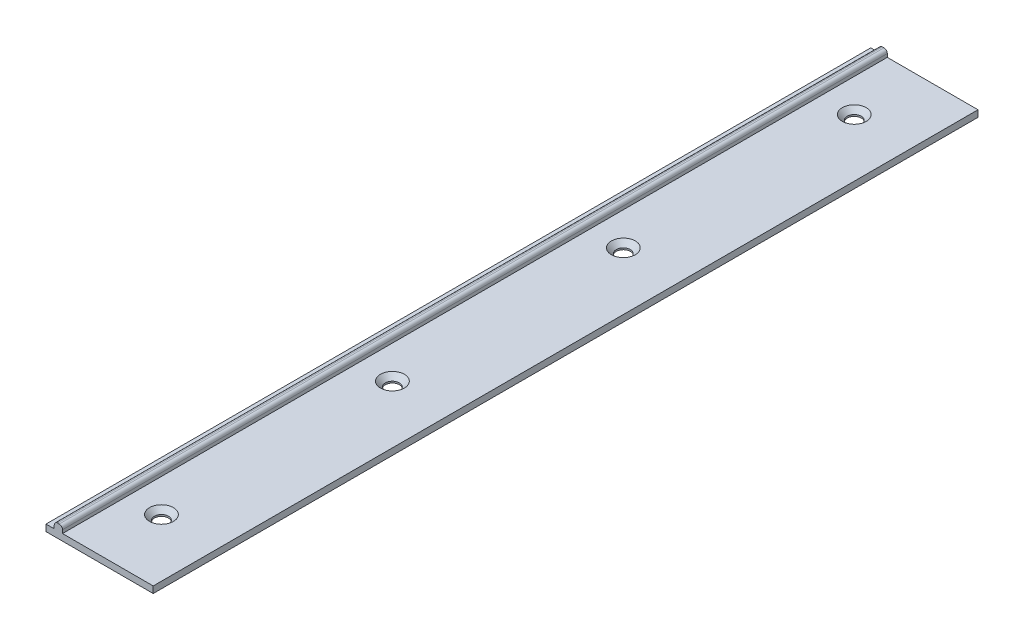
ISO-10303-21;
HEADER;
FILE_DESCRIPTION(('STEP AP214'),'2;1');
FILE_NAME('part.step','',(''),(''),'','','');
FILE_SCHEMA(('AUTOMOTIVE_DESIGN { 1 0 10303 214 1 1 1 1 }'));
ENDSEC;
DATA;
#1=APPLICATION_CONTEXT('core data for automotive mechanical design processes');
#2=APPLICATION_PROTOCOL_DEFINITION('international standard','automotive_design',2000,#1);
#3=PRODUCT_CONTEXT('',#1,'mechanical');
#4=PRODUCT('Part','Part','',(#3));
#5=PRODUCT_RELATED_PRODUCT_CATEGORY('part','',(#4));
#6=PRODUCT_DEFINITION_FORMATION('','',#4);
#7=PRODUCT_DEFINITION_CONTEXT('part definition',#1,'design');
#8=PRODUCT_DEFINITION('design','',#6,#7);
#9=PRODUCT_DEFINITION_SHAPE('','',#8);
#10=(LENGTH_UNIT() NAMED_UNIT(*) SI_UNIT(.MILLI.,.METRE.));
#11=(NAMED_UNIT(*) PLANE_ANGLE_UNIT() SI_UNIT($,.RADIAN.));
#12=(NAMED_UNIT(*) SI_UNIT($,.STERADIAN.) SOLID_ANGLE_UNIT());
#13=UNCERTAINTY_MEASURE_WITH_UNIT(LENGTH_MEASURE(1.E-05),#10,'distance_accuracy_value','');
#14=(GEOMETRIC_REPRESENTATION_CONTEXT(3) GLOBAL_UNCERTAINTY_ASSIGNED_CONTEXT((#13)) GLOBAL_UNIT_ASSIGNED_CONTEXT((#10,
#11,#12)) REPRESENTATION_CONTEXT('',''));
#15=CARTESIAN_POINT('',(0.,0.,0.));
#16=DIRECTION('',(0.,0.,1.));
#17=DIRECTION('',(1.,0.,0.));
#18=AXIS2_PLACEMENT_3D('',#15,#16,#17);
#19=CARTESIAN_POINT('',(0.,0.,-500.));
#20=DIRECTION('',(-1.,0.,0.));
#21=DIRECTION('',(0.,0.,1.));
#22=AXIS2_PLACEMENT_3D('',#19,#20,#21);
#23=PLANE('',#22);
#24=DIRECTION('',(0.,-1.,0.));
#25=VECTOR('',#24,1.);
#26=CARTESIAN_POINT('',(0.,0.,0.));
#27=LINE('',#26,#25);
#28=CARTESIAN_POINT('',(0.,4.,0.));
#29=VERTEX_POINT('',#28);
#30=CARTESIAN_POINT('',(0.,0.,0.));
#31=VERTEX_POINT('',#30);
#32=EDGE_CURVE('E163',#29,#31,#27,.T.);
#33=ORIENTED_EDGE('',*,*,#32,.F.);
#34=DIRECTION('',(0.,0.,1.));
#35=VECTOR('',#34,1.);
#36=CARTESIAN_POINT('',(0.,4.,-500.));
#37=LINE('',#36,#35);
#38=CARTESIAN_POINT('',(0.,4.,-500.));
#39=VERTEX_POINT('',#38);
#40=EDGE_CURVE('E141',#39,#29,#37,.T.);
#41=ORIENTED_EDGE('',*,*,#40,.F.);
#42=DIRECTION('',(0.,-1.,0.));
#43=VECTOR('',#42,1.);
#44=CARTESIAN_POINT('',(0.,0.,-500.));
#45=LINE('',#44,#43);
#46=CARTESIAN_POINT('',(0.,0.,-500.));
#47=VERTEX_POINT('',#46);
#48=EDGE_CURVE('E135',#39,#47,#45,.T.);
#49=ORIENTED_EDGE('',*,*,#48,.T.);
#50=DIRECTION('',(0.,0.,1.));
#51=VECTOR('',#50,1.);
#52=CARTESIAN_POINT('',(0.,0.,-500.));
#53=LINE('',#52,#51);
#54=EDGE_CURVE('E118',#47,#31,#53,.T.);
#55=ORIENTED_EDGE('',*,*,#54,.T.);
#56=EDGE_LOOP('',(#33,#41,#49,#55));
#57=FACE_BOUND('',#56,.T.);
#58=ADVANCED_FACE('F38',(#57),#23,.T.);
#59=CARTESIAN_POINT('',(0.,4.,-500.));
#60=DIRECTION('',(0.,1.,0.));
#61=DIRECTION('',(0.,0.,1.));
#62=AXIS2_PLACEMENT_3D('',#59,#60,#61);
#63=PLANE('',#62);
#64=DIRECTION('',(-1.,0.,0.));
#65=VECTOR('',#64,1.);
#66=CARTESIAN_POINT('',(0.,4.,0.));
#67=LINE('',#66,#65);
#68=CARTESIAN_POINT('',(5.,4.,0.));
#69=VERTEX_POINT('',#68);
#70=EDGE_CURVE('E142',#69,#29,#67,.T.);
#71=ORIENTED_EDGE('',*,*,#70,.F.);
#72=DIRECTION('',(0.,0.,1.));
#73=VECTOR('',#72,1.);
#74=CARTESIAN_POINT('',(5.,4.,-500.));
#75=LINE('',#74,#73);
#76=CARTESIAN_POINT('',(5.,4.,-500.));
#77=VERTEX_POINT('',#76);
#78=EDGE_CURVE('E182',#77,#69,#75,.T.);
#79=ORIENTED_EDGE('',*,*,#78,.F.);
#80=DIRECTION('',(-1.,0.,0.));
#81=VECTOR('',#80,1.);
#82=CARTESIAN_POINT('',(0.,4.,-500.));
#83=LINE('',#82,#81);
#84=EDGE_CURVE('E129',#77,#39,#83,.T.);
#85=ORIENTED_EDGE('',*,*,#84,.T.);
#86=ORIENTED_EDGE('',*,*,#40,.T.);
#87=EDGE_LOOP('',(#71,#79,#85,#86));
#88=FACE_BOUND('',#87,.T.);
#89=ADVANCED_FACE('F243',(#88),#63,.T.);
#90=CARTESIAN_POINT('',(5.,4.,-500.));
#91=DIRECTION('',(-1.,0.,0.));
#92=DIRECTION('',(0.,0.,1.));
#93=AXIS2_PLACEMENT_3D('',#90,#91,#92);
#94=PLANE('',#93);
#95=DIRECTION('',(0.,-1.,0.));
#96=VECTOR('',#95,1.);
#97=CARTESIAN_POINT('',(5.,4.,0.));
#98=LINE('',#97,#96);
#99=CARTESIAN_POINT('',(5.,6.,0.));
#100=VERTEX_POINT('',#99);
#101=EDGE_CURVE('E145',#100,#69,#98,.T.);
#102=ORIENTED_EDGE('',*,*,#101,.F.);
#103=DIRECTION('',(0.,0.,1.));
#104=VECTOR('',#103,1.);
#105=CARTESIAN_POINT('',(5.,6.,-500.));
#106=LINE('',#105,#104);
#107=CARTESIAN_POINT('',(5.,6.,-500.));
#108=VERTEX_POINT('',#107);
#109=EDGE_CURVE('E54',#100,#108,#106,.F.);
#110=ORIENTED_EDGE('',*,*,#109,.T.);
#111=DIRECTION('',(0.,-1.,0.));
#112=VECTOR('',#111,1.);
#113=CARTESIAN_POINT('',(5.,4.,-500.));
#114=LINE('',#113,#112);
#115=EDGE_CURVE('E160',#108,#77,#114,.T.);
#116=ORIENTED_EDGE('',*,*,#115,.T.);
#117=ORIENTED_EDGE('',*,*,#78,.T.);
#118=EDGE_LOOP('',(#102,#110,#116,#117));
#119=FACE_BOUND('',#118,.T.);
#120=ADVANCED_FACE('F248',(#119),#94,.T.);
#121=CARTESIAN_POINT('',(5.,8.,-500.));
#122=DIRECTION('',(0.,1.,0.));
#123=DIRECTION('',(-1.,0.,0.));
#124=AXIS2_PLACEMENT_3D('',#121,#122,#123);
#125=PLANE('',#124);
#126=DIRECTION('',(-1.,0.,0.));
#127=VECTOR('',#126,1.);
#128=CARTESIAN_POINT('',(5.,8.,0.));
#129=LINE('',#128,#127);
#130=CARTESIAN_POINT('',(8.00000000000001,8.,0.));
#131=VERTEX_POINT('',#130);
#132=CARTESIAN_POINT('',(7.,8.,0.));
#133=VERTEX_POINT('',#132);
#134=EDGE_CURVE('E176',#131,#133,#129,.T.);
#135=ORIENTED_EDGE('',*,*,#134,.F.);
#136=DIRECTION('',(0.,0.,1.));
#137=VECTOR('',#136,1.);
#138=CARTESIAN_POINT('',(8.00000000000001,8.,-500.));
#139=LINE('',#138,#137);
#140=CARTESIAN_POINT('',(8.00000000000001,8.,-500.));
#141=VERTEX_POINT('',#140);
#142=EDGE_CURVE('E199',#131,#141,#139,.F.);
#143=ORIENTED_EDGE('',*,*,#142,.T.);
#144=DIRECTION('',(-1.,0.,0.));
#145=VECTOR('',#144,1.);
#146=CARTESIAN_POINT('',(5.,8.,-500.));
#147=LINE('',#146,#145);
#148=CARTESIAN_POINT('',(7.,8.,-500.));
#149=VERTEX_POINT('',#148);
#150=EDGE_CURVE('E158',#141,#149,#147,.T.);
#151=ORIENTED_EDGE('',*,*,#150,.T.);
#152=DIRECTION('',(0.,0.,1.));
#153=VECTOR('',#152,1.);
#154=CARTESIAN_POINT('',(7.,8.,-500.));
#155=LINE('',#154,#153);
#156=EDGE_CURVE('E196',#149,#133,#155,.T.);
#157=ORIENTED_EDGE('',*,*,#156,.T.);
#158=EDGE_LOOP('',(#135,#143,#151,#157));
#159=FACE_BOUND('',#158,.T.);
#160=ADVANCED_FACE('F325',(#159),#125,.T.);
#161=CARTESIAN_POINT('',(10.,8.,-500.));
#162=DIRECTION('',(1.,0.,0.));
#163=DIRECTION('',(0.,1.,0.));
#164=AXIS2_PLACEMENT_3D('',#161,#162,#163);
#165=PLANE('',#164);
#166=DIRECTION('',(0.,1.,0.));
#167=VECTOR('',#166,1.);
#168=CARTESIAN_POINT('',(10.,8.,-500.));
#169=LINE('',#168,#167);
#170=CARTESIAN_POINT('',(10.,4.,-500.));
#171=VERTEX_POINT('',#170);
#172=CARTESIAN_POINT('',(10.,6.,-500.));
#173=VERTEX_POINT('',#172);
#174=EDGE_CURVE('E155',#171,#173,#169,.T.);
#175=ORIENTED_EDGE('',*,*,#174,.T.);
#176=DIRECTION('',(0.,0.,1.));
#177=VECTOR('',#176,1.);
#178=CARTESIAN_POINT('',(10.,6.,-500.));
#179=LINE('',#178,#177);
#180=CARTESIAN_POINT('',(10.,6.,0.));
#181=VERTEX_POINT('',#180);
#182=EDGE_CURVE('E181',#173,#181,#179,.T.);
#183=ORIENTED_EDGE('',*,*,#182,.T.);
#184=DIRECTION('',(0.,1.,0.));
#185=VECTOR('',#184,1.);
#186=CARTESIAN_POINT('',(10.,8.,0.));
#187=LINE('',#186,#185);
#188=CARTESIAN_POINT('',(10.,4.,0.));
#189=VERTEX_POINT('',#188);
#190=EDGE_CURVE('E173',#189,#181,#187,.T.);
#191=ORIENTED_EDGE('',*,*,#190,.F.);
#192=DIRECTION('',(0.,0.,1.));
#193=VECTOR('',#192,1.);
#194=CARTESIAN_POINT('',(10.,4.,-500.));
#195=LINE('',#194,#193);
#196=EDGE_CURVE('E185',#171,#189,#195,.T.);
#197=ORIENTED_EDGE('',*,*,#196,.F.);
#198=EDGE_LOOP('',(#175,#183,#191,#197));
#199=FACE_BOUND('',#198,.T.);
#200=ADVANCED_FACE('F328',(#199),#165,.T.);
#201=CARTESIAN_POINT('',(10.,4.,-500.));
#202=DIRECTION('',(0.,1.,0.));
#203=DIRECTION('',(0.,0.,1.));
#204=AXIS2_PLACEMENT_3D('',#201,#202,#203);
#205=PLANE('',#204);
#206=CARTESIAN_POINT('',(30.,4.,-460.));
#207=DIRECTION('',(0.,1.,0.));
#208=DIRECTION('',(0.,0.,1.));
#209=AXIS2_PLACEMENT_3D('',#206,#207,#208);
#210=CIRCLE('',#209,7.2500000000002);
#211=CARTESIAN_POINT('',(30.,4.,-452.75));
#212=VERTEX_POINT('',#211);
#213=EDGE_CURVE('E217',#212,#212,#210,.F.);
#214=ORIENTED_EDGE('',*,*,#213,.T.);
#215=EDGE_LOOP('',(#214));
#216=FACE_BOUND('',#215,.T.);
#217=CARTESIAN_POINT('',(30.,4.,-320.));
#218=DIRECTION('',(0.,1.,0.));
#219=DIRECTION('',(0.,0.,1.));
#220=AXIS2_PLACEMENT_3D('',#217,#218,#219);
#221=CIRCLE('',#220,7.2500000000002);
#222=CARTESIAN_POINT('',(30.,4.,-312.75));
#223=VERTEX_POINT('',#222);
#224=EDGE_CURVE('E214',#223,#223,#221,.F.);
#225=ORIENTED_EDGE('',*,*,#224,.T.);
#226=EDGE_LOOP('',(#225));
#227=FACE_BOUND('',#226,.T.);
#228=CARTESIAN_POINT('',(30.,4.,-180.));
#229=DIRECTION('',(0.,1.,0.));
#230=DIRECTION('',(0.,0.,1.));
#231=AXIS2_PLACEMENT_3D('',#228,#229,#230);
#232=CIRCLE('',#231,7.25000000000003);
#233=CARTESIAN_POINT('',(30.,4.,-172.75));
#234=VERTEX_POINT('',#233);
#235=EDGE_CURVE('E211',#234,#234,#232,.F.);
#236=ORIENTED_EDGE('',*,*,#235,.T.);
#237=EDGE_LOOP('',(#236));
#238=FACE_BOUND('',#237,.T.);
#239=CARTESIAN_POINT('',(30.,4.,-40.));
#240=DIRECTION('',(0.,1.,0.));
#241=DIRECTION('',(0.,0.,1.));
#242=AXIS2_PLACEMENT_3D('',#239,#240,#241);
#243=CIRCLE('',#242,7.25000000000015);
#244=CARTESIAN_POINT('',(30.,4.,-32.7499999999999));
#245=VERTEX_POINT('',#244);
#246=EDGE_CURVE('E208',#245,#245,#243,.F.);
#247=ORIENTED_EDGE('',*,*,#246,.T.);
#248=EDGE_LOOP('',(#247));
#249=FACE_BOUND('',#248,.T.);
#250=DIRECTION('',(-1.,0.,0.));
#251=VECTOR('',#250,1.);
#252=CARTESIAN_POINT('',(10.,4.,0.));
#253=LINE('',#252,#251);
#254=CARTESIAN_POINT('',(65.,4.,0.));
#255=VERTEX_POINT('',#254);
#256=EDGE_CURVE('E170',#255,#189,#253,.T.);
#257=ORIENTED_EDGE('',*,*,#256,.F.);
#258=DIRECTION('',(0.,0.,1.));
#259=VECTOR('',#258,1.);
#260=CARTESIAN_POINT('',(65.,4.,-500.));
#261=LINE('',#260,#259);
#262=CARTESIAN_POINT('',(65.,4.,-500.));
#263=VERTEX_POINT('',#262);
#264=EDGE_CURVE('E187',#263,#255,#261,.T.);
#265=ORIENTED_EDGE('',*,*,#264,.F.);
#266=DIRECTION('',(-1.,0.,0.));
#267=VECTOR('',#266,1.);
#268=CARTESIAN_POINT('',(10.,4.,-500.));
#269=LINE('',#268,#267);
#270=EDGE_CURVE('E152',#263,#171,#269,.T.);
#271=ORIENTED_EDGE('',*,*,#270,.T.);
#272=ORIENTED_EDGE('',*,*,#196,.T.);
#273=EDGE_LOOP('',(#257,#265,#271,#272));
#274=FACE_BOUND('',#273,.T.);
#275=ADVANCED_FACE('F332',(#216,#227,#238,#249,#274),#205,.T.);
#276=CARTESIAN_POINT('',(65.,4.,-500.));
#277=DIRECTION('',(1.,0.,0.));
#278=DIRECTION('',(0.,0.,-1.));
#279=AXIS2_PLACEMENT_3D('',#276,#277,#278);
#280=PLANE('',#279);
#281=DIRECTION('',(0.,1.,0.));
#282=VECTOR('',#281,1.);
#283=CARTESIAN_POINT('',(65.,4.,0.));
#284=LINE('',#283,#282);
#285=CARTESIAN_POINT('',(65.,0.,0.));
#286=VERTEX_POINT('',#285);
#287=EDGE_CURVE('E167',#286,#255,#284,.T.);
#288=ORIENTED_EDGE('',*,*,#287,.F.);
#289=DIRECTION('',(0.,0.,1.));
#290=VECTOR('',#289,1.);
#291=CARTESIAN_POINT('',(65.,0.,-500.));
#292=LINE('',#291,#290);
#293=CARTESIAN_POINT('',(65.,0.,-500.));
#294=VERTEX_POINT('',#293);
#295=EDGE_CURVE('E128',#294,#286,#292,.T.);
#296=ORIENTED_EDGE('',*,*,#295,.F.);
#297=DIRECTION('',(0.,1.,0.));
#298=VECTOR('',#297,1.);
#299=CARTESIAN_POINT('',(65.,4.,-500.));
#300=LINE('',#299,#298);
#301=EDGE_CURVE('E139',#294,#263,#300,.T.);
#302=ORIENTED_EDGE('',*,*,#301,.T.);
#303=ORIENTED_EDGE('',*,*,#264,.T.);
#304=EDGE_LOOP('',(#288,#296,#302,#303));
#305=FACE_BOUND('',#304,.T.);
#306=ADVANCED_FACE('F307',(#305),#280,.T.);
#307=CARTESIAN_POINT('',(0.,0.,-500.));
#308=DIRECTION('',(0.,-1.,0.));
#309=DIRECTION('',(0.,0.,-1.));
#310=AXIS2_PLACEMENT_3D('',#307,#308,#309);
#311=PLANE('',#310);
#312=CARTESIAN_POINT('',(30.,0.,-40.));
#313=DIRECTION('',(0.,-1.,0.));
#314=DIRECTION('',(0.,0.,-1.));
#315=AXIS2_PLACEMENT_3D('',#312,#313,#314);
#316=CIRCLE('',#315,4.25000000000001);
#317=CARTESIAN_POINT('',(30.,0.,-44.25));
#318=VERTEX_POINT('',#317);
#319=EDGE_CURVE('E165',#318,#318,#316,.T.);
#320=ORIENTED_EDGE('',*,*,#319,.F.);
#321=EDGE_LOOP('',(#320));
#322=FACE_BOUND('',#321,.T.);
#323=CARTESIAN_POINT('',(30.,0.,-180.));
#324=DIRECTION('',(0.,-1.,0.));
#325=DIRECTION('',(0.,0.,-1.));
#326=AXIS2_PLACEMENT_3D('',#323,#324,#325);
#327=CIRCLE('',#326,4.25000000000001);
#328=CARTESIAN_POINT('',(30.,0.,-184.25));
#329=VERTEX_POINT('',#328);
#330=EDGE_CURVE('E295',#329,#329,#327,.T.);
#331=ORIENTED_EDGE('',*,*,#330,.F.);
#332=EDGE_LOOP('',(#331));
#333=FACE_BOUND('',#332,.T.);
#334=CARTESIAN_POINT('',(30.,0.,-320.));
#335=DIRECTION('',(0.,-1.,0.));
#336=DIRECTION('',(0.,0.,-1.));
#337=AXIS2_PLACEMENT_3D('',#334,#335,#336);
#338=CIRCLE('',#337,4.25000000000001);
#339=CARTESIAN_POINT('',(30.,0.,-324.25));
#340=VERTEX_POINT('',#339);
#341=EDGE_CURVE('E293',#340,#340,#338,.T.);
#342=ORIENTED_EDGE('',*,*,#341,.F.);
#343=EDGE_LOOP('',(#342));
#344=FACE_BOUND('',#343,.T.);
#345=CARTESIAN_POINT('',(30.,0.,-460.));
#346=DIRECTION('',(0.,-1.,0.));
#347=DIRECTION('',(0.,0.,-1.));
#348=AXIS2_PLACEMENT_3D('',#345,#346,#347);
#349=CIRCLE('',#348,4.25000000000001);
#350=CARTESIAN_POINT('',(30.,0.,-464.25));
#351=VERTEX_POINT('',#350);
#352=EDGE_CURVE('E148',#351,#351,#349,.T.);
#353=ORIENTED_EDGE('',*,*,#352,.F.);
#354=EDGE_LOOP('',(#353));
#355=FACE_BOUND('',#354,.T.);
#356=DIRECTION('',(1.,0.,0.));
#357=VECTOR('',#356,1.);
#358=CARTESIAN_POINT('',(0.,0.,0.));
#359=LINE('',#358,#357);
#360=EDGE_CURVE('E123',#31,#286,#359,.T.);
#361=ORIENTED_EDGE('',*,*,#360,.F.);
#362=ORIENTED_EDGE('',*,*,#54,.F.);
#363=DIRECTION('',(1.,0.,0.));
#364=VECTOR('',#363,1.);
#365=CARTESIAN_POINT('',(0.,0.,-500.));
#366=LINE('',#365,#364);
#367=EDGE_CURVE('E121',#47,#294,#366,.T.);
#368=ORIENTED_EDGE('',*,*,#367,.T.);
#369=ORIENTED_EDGE('',*,*,#295,.T.);
#370=EDGE_LOOP('',(#361,#362,#368,#369));
#371=FACE_BOUND('',#370,.T.);
#372=ADVANCED_FACE('F120',(#322,#333,#344,#355,#371),#311,.T.);
#373=CARTESIAN_POINT('',(0.,0.,-500.));
#374=DIRECTION('',(0.,0.,-1.));
#375=DIRECTION('',(-1.,0.,0.));
#376=AXIS2_PLACEMENT_3D('',#373,#374,#375);
#377=PLANE('',#376);
#378=ORIENTED_EDGE('',*,*,#150,.F.);
#379=CARTESIAN_POINT('',(8.00000000000001,6.,-500.));
#380=DIRECTION('',(0.,0.,-1.));
#381=DIRECTION('',(-1.,0.,0.));
#382=AXIS2_PLACEMENT_3D('',#379,#380,#381);
#383=CIRCLE('',#382,2.);
#384=EDGE_CURVE('E202',#141,#173,#383,.T.);
#385=ORIENTED_EDGE('',*,*,#384,.T.);
#386=ORIENTED_EDGE('',*,*,#174,.F.);
#387=ORIENTED_EDGE('',*,*,#270,.F.);
#388=ORIENTED_EDGE('',*,*,#301,.F.);
#389=ORIENTED_EDGE('',*,*,#367,.F.);
#390=ORIENTED_EDGE('',*,*,#48,.F.);
#391=ORIENTED_EDGE('',*,*,#84,.F.);
#392=ORIENTED_EDGE('',*,*,#115,.F.);
#393=CARTESIAN_POINT('',(7.,6.,-500.));
#394=DIRECTION('',(0.,0.,-1.));
#395=DIRECTION('',(-1.,0.,0.));
#396=AXIS2_PLACEMENT_3D('',#393,#394,#395);
#397=CIRCLE('',#396,2.);
#398=EDGE_CURVE('E61',#108,#149,#397,.T.);
#399=ORIENTED_EDGE('',*,*,#398,.T.);
#400=EDGE_LOOP('',(#378,#385,#386,#387,#388,#389,#390,#391,#392,#399));
#401=FACE_BOUND('',#400,.T.);
#402=ADVANCED_FACE('F133',(#401),#377,.T.);
#403=CARTESIAN_POINT('',(0.,0.,0.));
#404=DIRECTION('',(0.,0.,-1.));
#405=DIRECTION('',(-1.,0.,0.));
#406=AXIS2_PLACEMENT_3D('',#403,#404,#405);
#407=PLANE('',#406);
#408=ORIENTED_EDGE('',*,*,#190,.T.);
#409=CARTESIAN_POINT('',(8.00000000000001,6.,0.));
#410=DIRECTION('',(0.,0.,-1.));
#411=DIRECTION('',(-1.,0.,0.));
#412=AXIS2_PLACEMENT_3D('',#409,#410,#411);
#413=CIRCLE('',#412,2.);
#414=EDGE_CURVE('E194',#181,#131,#413,.F.);
#415=ORIENTED_EDGE('',*,*,#414,.T.);
#416=ORIENTED_EDGE('',*,*,#134,.T.);
#417=CARTESIAN_POINT('',(7.,6.,0.));
#418=DIRECTION('',(0.,0.,-1.));
#419=DIRECTION('',(-1.,0.,0.));
#420=AXIS2_PLACEMENT_3D('',#417,#418,#419);
#421=CIRCLE('',#420,2.);
#422=EDGE_CURVE('E192',#133,#100,#421,.F.);
#423=ORIENTED_EDGE('',*,*,#422,.T.);
#424=ORIENTED_EDGE('',*,*,#101,.T.);
#425=ORIENTED_EDGE('',*,*,#70,.T.);
#426=ORIENTED_EDGE('',*,*,#32,.T.);
#427=ORIENTED_EDGE('',*,*,#360,.T.);
#428=ORIENTED_EDGE('',*,*,#287,.T.);
#429=ORIENTED_EDGE('',*,*,#256,.T.);
#430=EDGE_LOOP('',(#408,#415,#416,#423,#424,#425,#426,#427,#428,#429));
#431=FACE_BOUND('',#430,.T.);
#432=ADVANCED_FACE('F258',(#431),#407,.F.);
#433=CARTESIAN_POINT('',(8.00000000000001,6.,-500.));
#434=DIRECTION('',(0.,0.,1.));
#435=DIRECTION('',(1.,0.,0.));
#436=AXIS2_PLACEMENT_3D('',#433,#434,#435);
#437=CYLINDRICAL_SURFACE('',#436,2.);
#438=ORIENTED_EDGE('',*,*,#384,.F.);
#439=ORIENTED_EDGE('',*,*,#142,.F.);
#440=ORIENTED_EDGE('',*,*,#414,.F.);
#441=ORIENTED_EDGE('',*,*,#182,.F.);
#442=EDGE_LOOP('',(#438,#439,#440,#441));
#443=FACE_BOUND('',#442,.T.);
#444=ADVANCED_FACE('F254',(#443),#437,.T.);
#445=CARTESIAN_POINT('',(7.,6.,-500.));
#446=DIRECTION('',(0.,0.,1.));
#447=DIRECTION('',(1.,0.,0.));
#448=AXIS2_PLACEMENT_3D('',#445,#446,#447);
#449=CYLINDRICAL_SURFACE('',#448,2.);
#450=ORIENTED_EDGE('',*,*,#398,.F.);
#451=ORIENTED_EDGE('',*,*,#109,.F.);
#452=ORIENTED_EDGE('',*,*,#422,.F.);
#453=ORIENTED_EDGE('',*,*,#156,.F.);
#454=EDGE_LOOP('',(#450,#451,#452,#453));
#455=FACE_BOUND('',#454,.T.);
#456=ADVANCED_FACE('F257',(#455),#449,.T.);
#457=CARTESIAN_POINT('',(30.,10.,-460.));
#458=DIRECTION('',(0.,-1.,0.));
#459=DIRECTION('',(0.,0.,-1.));
#460=AXIS2_PLACEMENT_3D('',#457,#458,#459);
#461=CYLINDRICAL_SURFACE('',#460,4.25000000000001);
#462=CARTESIAN_POINT('',(30.,0.999999999999846,-460.));
#463=DIRECTION('',(0.,1.,0.));
#464=DIRECTION('',(0.,0.,1.));
#465=AXIS2_PLACEMENT_3D('',#462,#463,#464);
#466=CIRCLE('',#465,4.25000000000001);
#467=CARTESIAN_POINT('',(30.,0.999999999999846,-455.75));
#468=VERTEX_POINT('',#467);
#469=EDGE_CURVE('E205',#468,#468,#466,.T.);
#470=ORIENTED_EDGE('',*,*,#469,.T.);
#471=EDGE_LOOP('',(#470));
#472=FACE_BOUND('',#471,.T.);
#473=ORIENTED_EDGE('',*,*,#352,.T.);
#474=EDGE_LOOP('',(#473));
#475=FACE_BOUND('',#474,.T.);
#476=ADVANCED_FACE('F262',(#472,#475),#461,.F.);
#477=CARTESIAN_POINT('',(30.,10.,-320.));
#478=DIRECTION('',(0.,-1.,0.));
#479=DIRECTION('',(0.,0.,-1.));
#480=AXIS2_PLACEMENT_3D('',#477,#478,#479);
#481=CYLINDRICAL_SURFACE('',#480,4.25000000000001);
#482=CARTESIAN_POINT('',(30.,0.999999999999846,-320.));
#483=DIRECTION('',(0.,1.,0.));
#484=DIRECTION('',(0.,0.,1.));
#485=AXIS2_PLACEMENT_3D('',#482,#483,#484);
#486=CIRCLE('',#485,4.25000000000001);
#487=CARTESIAN_POINT('',(30.,0.999999999999846,-315.75));
#488=VERTEX_POINT('',#487);
#489=EDGE_CURVE('E220',#488,#488,#486,.T.);
#490=ORIENTED_EDGE('',*,*,#489,.T.);
#491=EDGE_LOOP('',(#490));
#492=FACE_BOUND('',#491,.T.);
#493=ORIENTED_EDGE('',*,*,#341,.T.);
#494=EDGE_LOOP('',(#493));
#495=FACE_BOUND('',#494,.T.);
#496=ADVANCED_FACE('F288',(#492,#495),#481,.F.);
#497=CARTESIAN_POINT('',(30.,10.,-180.));
#498=DIRECTION('',(0.,-1.,0.));
#499=DIRECTION('',(0.,0.,-1.));
#500=AXIS2_PLACEMENT_3D('',#497,#498,#499);
#501=CYLINDRICAL_SURFACE('',#500,4.25000000000001);
#502=CARTESIAN_POINT('',(30.,0.999999999999957,-180.));
#503=DIRECTION('',(0.,1.,0.));
#504=DIRECTION('',(0.,0.,1.));
#505=AXIS2_PLACEMENT_3D('',#502,#503,#504);
#506=CIRCLE('',#505,4.25000000000001);
#507=CARTESIAN_POINT('',(30.,0.999999999999957,-175.75));
#508=VERTEX_POINT('',#507);
#509=EDGE_CURVE('E47',#508,#508,#506,.T.);
#510=ORIENTED_EDGE('',*,*,#509,.T.);
#511=EDGE_LOOP('',(#510));
#512=FACE_BOUND('',#511,.T.);
#513=ORIENTED_EDGE('',*,*,#330,.T.);
#514=EDGE_LOOP('',(#513));
#515=FACE_BOUND('',#514,.T.);
#516=ADVANCED_FACE('F225',(#512,#515),#501,.F.);
#517=CARTESIAN_POINT('',(30.,10.,-40.));
#518=DIRECTION('',(0.,-1.,0.));
#519=DIRECTION('',(0.,0.,-1.));
#520=AXIS2_PLACEMENT_3D('',#517,#518,#519);
#521=CYLINDRICAL_SURFACE('',#520,4.25000000000001);
#522=CARTESIAN_POINT('',(30.,0.999999999999909,-40.));
#523=DIRECTION('',(0.,1.,0.));
#524=DIRECTION('',(0.,0.,1.));
#525=AXIS2_PLACEMENT_3D('',#522,#523,#524);
#526=CIRCLE('',#525,4.25000000000001);
#527=CARTESIAN_POINT('',(30.,0.999999999999909,-35.75));
#528=VERTEX_POINT('',#527);
#529=EDGE_CURVE('E11',#528,#528,#526,.T.);
#530=ORIENTED_EDGE('',*,*,#529,.T.);
#531=EDGE_LOOP('',(#530));
#532=FACE_BOUND('',#531,.T.);
#533=ORIENTED_EDGE('',*,*,#319,.T.);
#534=EDGE_LOOP('',(#533));
#535=FACE_BOUND('',#534,.T.);
#536=ADVANCED_FACE('F269',(#532,#535),#521,.F.);
#537=CARTESIAN_POINT('',(30.,0.999999999999846,-460.));
#538=DIRECTION('',(0.,1.,0.));
#539=DIRECTION('',(0.,0.,1.));
#540=AXIS2_PLACEMENT_3D('',#537,#538,#539);
#541=CONICAL_SURFACE('',#540,4.25000000000001,0.785398163397455);
#542=ORIENTED_EDGE('',*,*,#213,.F.);
#543=EDGE_LOOP('',(#542));
#544=FACE_BOUND('',#543,.T.);
#545=ORIENTED_EDGE('',*,*,#469,.F.);
#546=EDGE_LOOP('',(#545));
#547=FACE_BOUND('',#546,.T.);
#548=ADVANCED_FACE('F237',(#544,#547),#541,.F.);
#549=CARTESIAN_POINT('',(30.,0.999999999999846,-320.));
#550=DIRECTION('',(0.,1.,0.));
#551=DIRECTION('',(0.,0.,1.));
#552=AXIS2_PLACEMENT_3D('',#549,#550,#551);
#553=CONICAL_SURFACE('',#552,4.25000000000001,0.785398163397455);
#554=ORIENTED_EDGE('',*,*,#224,.F.);
#555=EDGE_LOOP('',(#554));
#556=FACE_BOUND('',#555,.T.);
#557=ORIENTED_EDGE('',*,*,#489,.F.);
#558=EDGE_LOOP('',(#557));
#559=FACE_BOUND('',#558,.T.);
#560=ADVANCED_FACE('F230',(#556,#559),#553,.F.);
#561=CARTESIAN_POINT('',(30.,0.999999999999957,-180.));
#562=DIRECTION('',(0.,1.,0.));
#563=DIRECTION('',(0.,0.,1.));
#564=AXIS2_PLACEMENT_3D('',#561,#562,#563);
#565=CONICAL_SURFACE('',#564,4.25000000000001,0.785398163397446);
#566=ORIENTED_EDGE('',*,*,#235,.F.);
#567=EDGE_LOOP('',(#566));
#568=FACE_BOUND('',#567,.T.);
#569=ORIENTED_EDGE('',*,*,#509,.F.);
#570=EDGE_LOOP('',(#569));
#571=FACE_BOUND('',#570,.T.);
#572=ADVANCED_FACE('F228',(#568,#571),#565,.F.);
#573=CARTESIAN_POINT('',(30.,0.999999999999909,-40.));
#574=DIRECTION('',(0.,1.,0.));
#575=DIRECTION('',(0.,0.,1.));
#576=AXIS2_PLACEMENT_3D('',#573,#574,#575);
#577=CONICAL_SURFACE('',#576,4.25000000000001,0.785398163397455);
#578=ORIENTED_EDGE('',*,*,#246,.F.);
#579=EDGE_LOOP('',(#578));
#580=FACE_BOUND('',#579,.T.);
#581=ORIENTED_EDGE('',*,*,#529,.F.);
#582=EDGE_LOOP('',(#581));
#583=FACE_BOUND('',#582,.T.);
#584=ADVANCED_FACE('F41',(#580,#583),#577,.F.);
#585=CLOSED_SHELL('',(#58,#89,#120,#160,#200,#275,#306,#372,#402,#432,#444,#456,#476,#496,#516,
#536,#548,#560,#572,#584));
#586=MANIFOLD_SOLID_BREP('B2',#585);
#587=ADVANCED_BREP_SHAPE_REPRESENTATION('',(#18,#586),#14);
#588=SHAPE_DEFINITION_REPRESENTATION(#9,#587);
ENDSEC;
END-ISO-10303-21;
